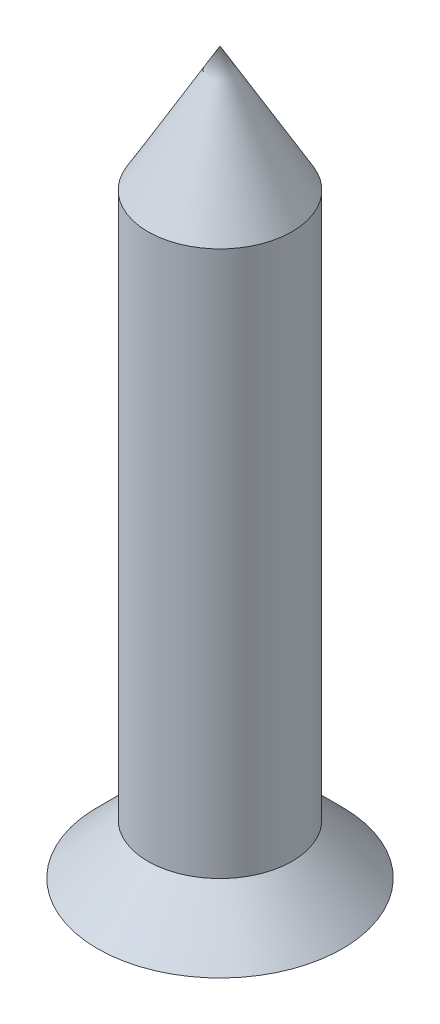
ISO-10303-21;
HEADER;
FILE_DESCRIPTION(('STEP AP214'),'2;1');
FILE_NAME('part.step','',(''),(''),'','','');
FILE_SCHEMA(('AUTOMOTIVE_DESIGN { 1 0 10303 214 1 1 1 1 }'));
ENDSEC;
DATA;
#1=APPLICATION_CONTEXT('core data for automotive mechanical design processes');
#2=APPLICATION_PROTOCOL_DEFINITION('international standard','automotive_design',2000,#1);
#3=PRODUCT_CONTEXT('',#1,'mechanical');
#4=PRODUCT('Part','Part','',(#3));
#5=PRODUCT_RELATED_PRODUCT_CATEGORY('part','',(#4));
#6=PRODUCT_DEFINITION_FORMATION('','',#4);
#7=PRODUCT_DEFINITION_CONTEXT('part definition',#1,'design');
#8=PRODUCT_DEFINITION('design','',#6,#7);
#9=PRODUCT_DEFINITION_SHAPE('','',#8);
#10=(LENGTH_UNIT() NAMED_UNIT(*) SI_UNIT(.MILLI.,.METRE.));
#11=(NAMED_UNIT(*) PLANE_ANGLE_UNIT() SI_UNIT($,.RADIAN.));
#12=(NAMED_UNIT(*) SI_UNIT($,.STERADIAN.) SOLID_ANGLE_UNIT());
#13=UNCERTAINTY_MEASURE_WITH_UNIT(LENGTH_MEASURE(1.E-05),#10,'distance_accuracy_value','');
#14=(GEOMETRIC_REPRESENTATION_CONTEXT(3) GLOBAL_UNCERTAINTY_ASSIGNED_CONTEXT((#13)) GLOBAL_UNIT_ASSIGNED_CONTEXT((#10,
#11,#12)) REPRESENTATION_CONTEXT('',''));
#15=CARTESIAN_POINT('',(0.,0.,0.));
#16=DIRECTION('',(0.,0.,1.));
#17=DIRECTION('',(1.,0.,0.));
#18=AXIS2_PLACEMENT_3D('',#15,#16,#17);
#19=CARTESIAN_POINT('',(0.,1.,0.));
#20=DIRECTION('',(0.,-1.,0.));
#21=DIRECTION('',(0.,0.,-1.));
#22=AXIS2_PLACEMENT_3D('',#19,#20,#21);
#23=PLANE('',#22);
#24=DIRECTION('',(-0.866025403784439,0.,-0.5));
#25=VECTOR('',#24,1.);
#26=CARTESIAN_POINT('',(0.,1.,-0.692820323027551));
#27=LINE('',#26,#25);
#28=CARTESIAN_POINT('',(0.,1.,-0.692820323027551));
#29=VERTEX_POINT('',#28);
#30=CARTESIAN_POINT('',(0.6,1.,-0.346410161513776));
#31=VERTEX_POINT('',#30);
#32=EDGE_CURVE('E88',#29,#31,#27,.F.);
#33=ORIENTED_EDGE('',*,*,#32,.T.);
#34=DIRECTION('',(0.,0.,-1.));
#35=VECTOR('',#34,1.);
#36=CARTESIAN_POINT('',(0.6,1.,-0.346410161513776));
#37=LINE('',#36,#35);
#38=CARTESIAN_POINT('',(0.6,1.,0.346410161513776));
#39=VERTEX_POINT('',#38);
#40=EDGE_CURVE('E95',#31,#39,#37,.F.);
#41=ORIENTED_EDGE('',*,*,#40,.T.);
#42=DIRECTION('',(0.866025403784439,0.,-0.5));
#43=VECTOR('',#42,1.);
#44=CARTESIAN_POINT('',(0.6,1.,0.346410161513776));
#45=LINE('',#44,#43);
#46=CARTESIAN_POINT('',(0.,1.,0.692820323027551));
#47=VERTEX_POINT('',#46);
#48=EDGE_CURVE('E100',#39,#47,#45,.F.);
#49=ORIENTED_EDGE('',*,*,#48,.T.);
#50=DIRECTION('',(0.866025403784439,0.,0.5));
#51=VECTOR('',#50,1.);
#52=CARTESIAN_POINT('',(0.,1.,0.692820323027551));
#53=LINE('',#52,#51);
#54=CARTESIAN_POINT('',(-0.6,1.,0.346410161513776));
#55=VERTEX_POINT('',#54);
#56=EDGE_CURVE('E72',#47,#55,#53,.F.);
#57=ORIENTED_EDGE('',*,*,#56,.T.);
#58=DIRECTION('',(0.,0.,1.));
#59=VECTOR('',#58,1.);
#60=CARTESIAN_POINT('',(-0.6,1.,0.346410161513776));
#61=LINE('',#60,#59);
#62=CARTESIAN_POINT('',(-0.6,1.,-0.346410161513776));
#63=VERTEX_POINT('',#62);
#64=EDGE_CURVE('E69',#55,#63,#61,.F.);
#65=ORIENTED_EDGE('',*,*,#64,.T.);
#66=DIRECTION('',(-0.866025403784439,0.,0.5));
#67=VECTOR('',#66,1.);
#68=CARTESIAN_POINT('',(-0.6,1.,-0.346410161513776));
#69=LINE('',#68,#67);
#70=EDGE_CURVE('E66',#63,#29,#69,.F.);
#71=ORIENTED_EDGE('',*,*,#70,.T.);
#72=EDGE_LOOP('',(#33,#41,#49,#57,#65,#71));
#73=FACE_BOUND('',#72,.T.);
#74=ADVANCED_FACE('F17',(#73),#23,.T.);
#75=CARTESIAN_POINT('',(-0.6,1.,0.346410161513776));
#76=DIRECTION('',(-1.,0.,0.));
#77=DIRECTION('',(0.,0.,1.));
#78=AXIS2_PLACEMENT_3D('',#75,#76,#77);
#79=PLANE('',#78);
#80=DIRECTION('',(0.,1.,0.));
#81=VECTOR('',#80,1.);
#82=CARTESIAN_POINT('',(-0.6,1.,-0.346410161513776));
#83=LINE('',#82,#81);
#84=CARTESIAN_POINT('',(-0.6,0.,-0.346410161513776));
#85=VERTEX_POINT('',#84);
#86=EDGE_CURVE('E75',#85,#63,#83,.T.);
#87=ORIENTED_EDGE('',*,*,#86,.T.);
#88=ORIENTED_EDGE('',*,*,#64,.F.);
#89=DIRECTION('',(0.,1.,0.));
#90=VECTOR('',#89,1.);
#91=CARTESIAN_POINT('',(-0.6,1.,0.346410161513776));
#92=LINE('',#91,#90);
#93=CARTESIAN_POINT('',(-0.6,0.,0.346410161513776));
#94=VERTEX_POINT('',#93);
#95=EDGE_CURVE('E106',#55,#94,#92,.F.);
#96=ORIENTED_EDGE('',*,*,#95,.T.);
#97=DIRECTION('',(0.,0.,1.));
#98=VECTOR('',#97,1.);
#99=CARTESIAN_POINT('',(-0.6,0.,0.));
#100=LINE('',#99,#98);
#101=EDGE_CURVE('E79',#94,#85,#100,.F.);
#102=ORIENTED_EDGE('',*,*,#101,.T.);
#103=EDGE_LOOP('',(#87,#88,#96,#102));
#104=FACE_BOUND('',#103,.T.);
#105=ADVANCED_FACE('F77',(#104),#79,.F.);
#106=CARTESIAN_POINT('',(-0.6,1.,-0.346410161513776));
#107=DIRECTION('',(-0.5,0.,-0.866025403784439));
#108=DIRECTION('',(-0.866025403784439,0.,0.5));
#109=AXIS2_PLACEMENT_3D('',#106,#107,#108);
#110=PLANE('',#109);
#111=DIRECTION('',(0.,1.,0.));
#112=VECTOR('',#111,1.);
#113=CARTESIAN_POINT('',(0.,1.,-0.692820323027551));
#114=LINE('',#113,#112);
#115=CARTESIAN_POINT('',(0.,0.,-0.692820323027551));
#116=VERTEX_POINT('',#115);
#117=EDGE_CURVE('E85',#116,#29,#114,.T.);
#118=ORIENTED_EDGE('',*,*,#117,.T.);
#119=ORIENTED_EDGE('',*,*,#70,.F.);
#120=ORIENTED_EDGE('',*,*,#86,.F.);
#121=DIRECTION('',(0.866025403784438,0.,-0.5));
#122=VECTOR('',#121,1.);
#123=CARTESIAN_POINT('',(-0.6,0.,-0.346410161513776));
#124=LINE('',#123,#122);
#125=EDGE_CURVE('E111',#85,#116,#124,.T.);
#126=ORIENTED_EDGE('',*,*,#125,.T.);
#127=EDGE_LOOP('',(#118,#119,#120,#126));
#128=FACE_BOUND('',#127,.T.);
#129=ADVANCED_FACE('F83',(#128),#110,.F.);
#130=CARTESIAN_POINT('',(0.,1.,-0.692820323027551));
#131=DIRECTION('',(0.5,0.,-0.866025403784439));
#132=DIRECTION('',(-0.866025403784439,0.,-0.5));
#133=AXIS2_PLACEMENT_3D('',#130,#131,#132);
#134=PLANE('',#133);
#135=DIRECTION('',(0.,1.,0.));
#136=VECTOR('',#135,1.);
#137=CARTESIAN_POINT('',(0.6,1.,-0.346410161513776));
#138=LINE('',#137,#136);
#139=CARTESIAN_POINT('',(0.6,0.,-0.346410161513776));
#140=VERTEX_POINT('',#139);
#141=EDGE_CURVE('E92',#140,#31,#138,.T.);
#142=ORIENTED_EDGE('',*,*,#141,.T.);
#143=ORIENTED_EDGE('',*,*,#32,.F.);
#144=ORIENTED_EDGE('',*,*,#117,.F.);
#145=DIRECTION('',(0.866025403784439,0.,0.5));
#146=VECTOR('',#145,1.);
#147=CARTESIAN_POINT('',(0.,0.,-0.692820323027551));
#148=LINE('',#147,#146);
#149=EDGE_CURVE('E113',#116,#140,#148,.T.);
#150=ORIENTED_EDGE('',*,*,#149,.T.);
#151=EDGE_LOOP('',(#142,#143,#144,#150));
#152=FACE_BOUND('',#151,.T.);
#153=ADVANCED_FACE('F206',(#152),#134,.F.);
#154=CARTESIAN_POINT('',(0.6,1.,-0.346410161513776));
#155=DIRECTION('',(1.,0.,0.));
#156=DIRECTION('',(0.,0.,-1.));
#157=AXIS2_PLACEMENT_3D('',#154,#155,#156);
#158=PLANE('',#157);
#159=DIRECTION('',(0.,1.,0.));
#160=VECTOR('',#159,1.);
#161=CARTESIAN_POINT('',(0.6,1.,0.346410161513776));
#162=LINE('',#161,#160);
#163=CARTESIAN_POINT('',(0.6,0.,0.346410161513776));
#164=VERTEX_POINT('',#163);
#165=EDGE_CURVE('E97',#164,#39,#162,.T.);
#166=ORIENTED_EDGE('',*,*,#165,.T.);
#167=ORIENTED_EDGE('',*,*,#40,.F.);
#168=ORIENTED_EDGE('',*,*,#141,.F.);
#169=DIRECTION('',(0.,0.,1.));
#170=VECTOR('',#169,1.);
#171=CARTESIAN_POINT('',(0.6,0.,0.));
#172=LINE('',#171,#170);
#173=EDGE_CURVE('E115',#140,#164,#172,.T.);
#174=ORIENTED_EDGE('',*,*,#173,.T.);
#175=EDGE_LOOP('',(#166,#167,#168,#174));
#176=FACE_BOUND('',#175,.T.);
#177=ADVANCED_FACE('F148',(#176),#158,.F.);
#178=CARTESIAN_POINT('',(0.6,1.,0.346410161513776));
#179=DIRECTION('',(0.5,0.,0.866025403784439));
#180=DIRECTION('',(0.866025403784439,0.,-0.5));
#181=AXIS2_PLACEMENT_3D('',#178,#179,#180);
#182=PLANE('',#181);
#183=DIRECTION('',(0.,1.,0.));
#184=VECTOR('',#183,1.);
#185=CARTESIAN_POINT('',(0.,1.,0.692820323027551));
#186=LINE('',#185,#184);
#187=CARTESIAN_POINT('',(0.,0.,0.692820323027551));
#188=VERTEX_POINT('',#187);
#189=EDGE_CURVE('E102',#188,#47,#186,.T.);
#190=ORIENTED_EDGE('',*,*,#189,.T.);
#191=ORIENTED_EDGE('',*,*,#48,.F.);
#192=ORIENTED_EDGE('',*,*,#165,.F.);
#193=DIRECTION('',(-0.866025403784438,0.,0.5));
#194=VECTOR('',#193,1.);
#195=CARTESIAN_POINT('',(0.6,0.,0.346410161513776));
#196=LINE('',#195,#194);
#197=EDGE_CURVE('E117',#164,#188,#196,.T.);
#198=ORIENTED_EDGE('',*,*,#197,.T.);
#199=EDGE_LOOP('',(#190,#191,#192,#198));
#200=FACE_BOUND('',#199,.T.);
#201=ADVANCED_FACE('F140',(#200),#182,.F.);
#202=CARTESIAN_POINT('',(0.,1.,0.692820323027551));
#203=DIRECTION('',(-0.5,0.,0.866025403784439));
#204=DIRECTION('',(0.866025403784439,0.,0.5));
#205=AXIS2_PLACEMENT_3D('',#202,#203,#204);
#206=PLANE('',#205);
#207=ORIENTED_EDGE('',*,*,#95,.F.);
#208=ORIENTED_EDGE('',*,*,#56,.F.);
#209=ORIENTED_EDGE('',*,*,#189,.F.);
#210=DIRECTION('',(-0.866025403784439,0.,-0.5));
#211=VECTOR('',#210,1.);
#212=CARTESIAN_POINT('',(0.,0.,0.692820323027551));
#213=LINE('',#212,#211);
#214=EDGE_CURVE('E119',#188,#94,#213,.T.);
#215=ORIENTED_EDGE('',*,*,#214,.T.);
#216=EDGE_LOOP('',(#207,#208,#209,#215));
#217=FACE_BOUND('',#216,.T.);
#218=ADVANCED_FACE('F133',(#217),#206,.F.);
#219=CARTESIAN_POINT('',(0.,0.,0.));
#220=DIRECTION('',(0.,1.,0.));
#221=DIRECTION('',(0.,0.,1.));
#222=AXIS2_PLACEMENT_3D('',#219,#220,#221);
#223=PLANE('',#222);
#224=CARTESIAN_POINT('',(0.,1.13686837721616E-10,0.));
#225=DIRECTION('',(0.,-1.,0.));
#226=DIRECTION('',(0.,0.,-1.));
#227=AXIS2_PLACEMENT_3D('',#224,#225,#226);
#228=CIRCLE('',#227,1.70000000002801);
#229=CARTESIAN_POINT('',(0.,1.13686837721616E-10,-1.70000000002801));
#230=VERTEX_POINT('',#229);
#231=EDGE_CURVE('E20',#230,#230,#228,.F.);
#232=ORIENTED_EDGE('',*,*,#231,.F.);
#233=EDGE_LOOP('',(#232));
#234=FACE_BOUND('',#233,.T.);
#235=ORIENTED_EDGE('',*,*,#197,.F.);
#236=ORIENTED_EDGE('',*,*,#173,.F.);
#237=ORIENTED_EDGE('',*,*,#149,.F.);
#238=ORIENTED_EDGE('',*,*,#125,.F.);
#239=ORIENTED_EDGE('',*,*,#101,.F.);
#240=ORIENTED_EDGE('',*,*,#214,.F.);
#241=EDGE_LOOP('',(#235,#236,#237,#238,#239,#240));
#242=FACE_BOUND('',#241,.T.);
#243=ADVANCED_FACE('F130',(#234,#242),#223,.F.);
#244=CARTESIAN_POINT('',(0.,1.70530256582424E-10,0.));
#245=DIRECTION('',(0.,-1.,0.));
#246=DIRECTION('',(0.,0.,-1.));
#247=AXIS2_PLACEMENT_3D('',#244,#245,#246);
#248=CONICAL_SURFACE('',#247,1.69999999997117,0.785398163397448);
#249=ORIENTED_EDGE('',*,*,#231,.T.);
#250=EDGE_LOOP('',(#249));
#251=FACE_BOUND('',#250,.T.);
#252=CARTESIAN_POINT('',(0.,0.699999999999992,0.));
#253=DIRECTION('',(0.,1.,0.));
#254=DIRECTION('',(0.,0.,1.));
#255=AXIS2_PLACEMENT_3D('',#252,#253,#254);
#256=CIRCLE('',#255,1.);
#257=CARTESIAN_POINT('',(0.,0.699999999999992,1.));
#258=VERTEX_POINT('',#257);
#259=EDGE_CURVE('E26',#258,#258,#256,.T.);
#260=ORIENTED_EDGE('',*,*,#259,.F.);
#261=EDGE_LOOP('',(#260));
#262=FACE_BOUND('',#261,.T.);
#263=ADVANCED_FACE('F127',(#251,#262),#248,.T.);
#264=CARTESIAN_POINT('',(0.,8.26794919248641,0.));
#265=DIRECTION('',(0.,-1.,0.));
#266=DIRECTION('',(0.,0.,-1.));
#267=AXIS2_PLACEMENT_3D('',#264,#265,#266);
#268=CONICAL_SURFACE('',#267,0.99999999991951,0.523598775395821);
#269=CARTESIAN_POINT('',(0.,10.0000000000762,8.5265128291212E-11));
#270=VERTEX_POINT('',#269);
#271=VERTEX_LOOP('',#270);
#272=FACE_BOUND('',#271,.T.);
#273=CARTESIAN_POINT('',(0.,8.26794919243109,0.));
#274=DIRECTION('',(0.,1.,0.));
#275=DIRECTION('',(0.,0.,1.));
#276=AXIS2_PLACEMENT_3D('',#273,#274,#275);
#277=CIRCLE('',#276,1.);
#278=CARTESIAN_POINT('',(0.,8.26794919243109,1.));
#279=VERTEX_POINT('',#278);
#280=EDGE_CURVE('E11',#279,#279,#277,.F.);
#281=ORIENTED_EDGE('',*,*,#280,.F.);
#282=EDGE_LOOP('',(#281));
#283=FACE_BOUND('',#282,.T.);
#284=ADVANCED_FACE('F152',(#272,#283),#268,.T.);
#285=CARTESIAN_POINT('',(0.,0.,0.));
#286=DIRECTION('',(0.,1.,0.));
#287=DIRECTION('',(0.,0.,1.));
#288=AXIS2_PLACEMENT_3D('',#285,#286,#287);
#289=CYLINDRICAL_SURFACE('',#288,1.);
#290=ORIENTED_EDGE('',*,*,#280,.T.);
#291=EDGE_LOOP('',(#290));
#292=FACE_BOUND('',#291,.T.);
#293=ORIENTED_EDGE('',*,*,#259,.T.);
#294=EDGE_LOOP('',(#293));
#295=FACE_BOUND('',#294,.T.);
#296=ADVANCED_FACE('F150',(#292,#295),#289,.T.);
#297=CLOSED_SHELL('',(#74,#105,#129,#153,#177,#201,#218,#243,#263,#284,#296));
#298=MANIFOLD_SOLID_BREP('B1',#297);
#299=ADVANCED_BREP_SHAPE_REPRESENTATION('',(#18,#298),#14);
#300=SHAPE_DEFINITION_REPRESENTATION(#9,#299);
ENDSEC;
END-ISO-10303-21;
